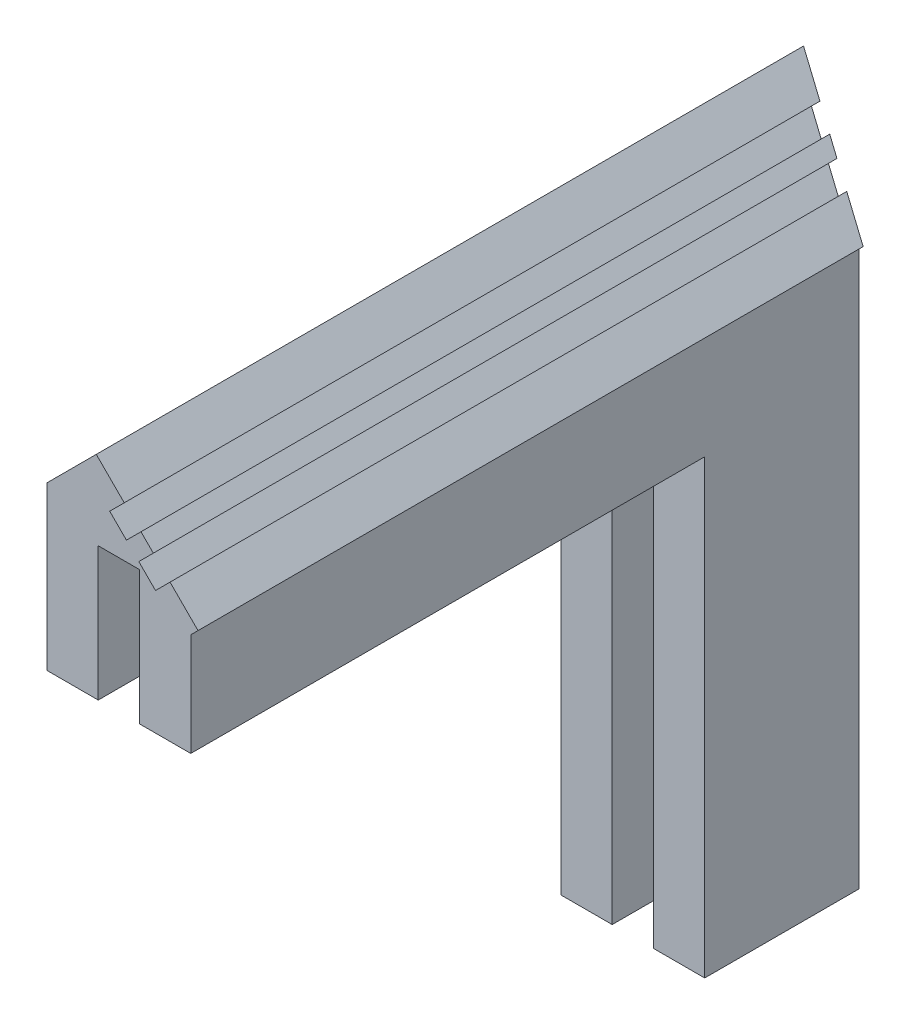
ISO-10303-21;
HEADER;
FILE_DESCRIPTION(('STEP AP214'),'2;1');
FILE_NAME('part.step','',(''),(''),'','','');
FILE_SCHEMA(('AUTOMOTIVE_DESIGN { 1 0 10303 214 1 1 1 1 }'));
ENDSEC;
DATA;
#1=APPLICATION_CONTEXT('core data for automotive mechanical design processes');
#2=APPLICATION_PROTOCOL_DEFINITION('international standard','automotive_design',2000,#1);
#3=PRODUCT_CONTEXT('',#1,'mechanical');
#4=PRODUCT('Part','Part','',(#3));
#5=PRODUCT_RELATED_PRODUCT_CATEGORY('part','',(#4));
#6=PRODUCT_DEFINITION_FORMATION('','',#4);
#7=PRODUCT_DEFINITION_CONTEXT('part definition',#1,'design');
#8=PRODUCT_DEFINITION('design','',#6,#7);
#9=PRODUCT_DEFINITION_SHAPE('','',#8);
#10=(LENGTH_UNIT() NAMED_UNIT(*) SI_UNIT(.MILLI.,.METRE.));
#11=(NAMED_UNIT(*) PLANE_ANGLE_UNIT() SI_UNIT($,.RADIAN.));
#12=(NAMED_UNIT(*) SI_UNIT($,.STERADIAN.) SOLID_ANGLE_UNIT());
#13=UNCERTAINTY_MEASURE_WITH_UNIT(LENGTH_MEASURE(1.E-05),#10,'distance_accuracy_value','');
#14=(GEOMETRIC_REPRESENTATION_CONTEXT(3) GLOBAL_UNCERTAINTY_ASSIGNED_CONTEXT((#13)) GLOBAL_UNIT_ASSIGNED_CONTEXT((#10,
#11,#12)) REPRESENTATION_CONTEXT('',''));
#15=CARTESIAN_POINT('',(0.,0.,0.));
#16=DIRECTION('',(0.,0.,1.));
#17=DIRECTION('',(1.,0.,0.));
#18=AXIS2_PLACEMENT_3D('',#15,#16,#17);
#19=CARTESIAN_POINT('',(0.707106781186546,0.707106781186549,-17.5217474244804));
#20=DIRECTION('',(0.707106781186544,0.707106781186551,0.));
#21=DIRECTION('',(-0.707106781186551,0.707106781186544,0.));
#22=AXIS2_PLACEMENT_3D('',#19,#20,#21);
#23=PLANE('',#22);
#24=DIRECTION('',(-0.678598344545851,0.678598344545844,-0.281084637714817));
#25=VECTOR('',#24,1.);
#26=CARTESIAN_POINT('',(-2.69092137036364,4.1051349327367,-1.1146161268842));
#27=LINE('',#26,#25);
#28=CARTESIAN_POINT('',(-3.64159992311075,5.05581348548379,-1.50840007688926));
#29=VERTEX_POINT('',#28);
#30=CARTESIAN_POINT('',(-4.84368145112788,6.25789501350092,-2.00631854887213));
#31=VERTEX_POINT('',#30);
#32=EDGE_CURVE('E230',#29,#31,#27,.T.);
#33=ORIENTED_EDGE('',*,*,#32,.T.);
#34=DIRECTION('',(0.,0.,1.));
#35=VECTOR('',#34,1.);
#36=CARTESIAN_POINT('',(-4.84368145112788,6.25789501350092,-7.11318219994969));
#37=LINE('',#36,#35);
#38=CARTESIAN_POINT('',(-4.84368145112789,6.25789501350092,65.));
#39=VERTEX_POINT('',#38);
#40=EDGE_CURVE('E214',#31,#39,#37,.T.);
#41=ORIENTED_EDGE('',*,*,#40,.T.);
#42=DIRECTION('',(-0.707106781186551,0.707106781186544,0.));
#43=VECTOR('',#42,1.);
#44=CARTESIAN_POINT('',(0.707106781186546,0.707106781186549,65.));
#45=LINE('',#44,#43);
#46=CARTESIAN_POINT('',(-3.64159992311074,5.05581348548379,65.));
#47=VERTEX_POINT('',#46);
#48=EDGE_CURVE('E472',#47,#39,#45,.T.);
#49=ORIENTED_EDGE('',*,*,#48,.F.);
#50=DIRECTION('',(0.,0.,1.));
#51=VECTOR('',#50,1.);
#52=CARTESIAN_POINT('',(-3.64159992311074,5.05581348548379,-7.11318219994969));
#53=LINE('',#52,#51);
#54=EDGE_CURVE('E237',#29,#47,#53,.T.);
#55=ORIENTED_EDGE('',*,*,#54,.F.);
#56=EDGE_LOOP('',(#33,#41,#49,#55));
#57=FACE_BOUND('',#56,.T.);
#58=ADVANCED_FACE('F65',(#57),#23,.T.);
#59=CARTESIAN_POINT('',(0.707106781186546,0.707106781186548,0.292893218813449));
#60=VERTEX_POINT('',#59);
#61=CARTESIAN_POINT('',(-2.01525432638168,3.42946788875474,-0.83474567361833));
#62=VERTEX_POINT('',#61);
#63=EDGE_CURVE('E239',#60,#62,#27,.T.);
#64=ORIENTED_EDGE('',*,*,#63,.T.);
#65=DIRECTION('',(0.,0.,1.));
#66=VECTOR('',#65,1.);
#67=CARTESIAN_POINT('',(-2.01525432638168,3.42946788875474,-7.11318219994969));
#68=LINE('',#67,#66);
#69=CARTESIAN_POINT('',(-2.01525432638168,3.42946788875474,65.));
#70=VERTEX_POINT('',#69);
#71=EDGE_CURVE('E444',#62,#70,#68,.T.);
#72=ORIENTED_EDGE('',*,*,#71,.T.);
#73=CARTESIAN_POINT('',(0.707106781186546,0.707106781186549,65.));
#74=VERTEX_POINT('',#73);
#75=EDGE_CURVE('E469',#74,#70,#45,.T.);
#76=ORIENTED_EDGE('',*,*,#75,.F.);
#77=DIRECTION('',(0.,0.,1.));
#78=VECTOR('',#77,1.);
#79=CARTESIAN_POINT('',(0.707106781186546,0.707106781186549,-17.5217474244804));
#80=LINE('',#79,#78);
#81=EDGE_CURVE('E246',#60,#74,#80,.T.);
#82=ORIENTED_EDGE('',*,*,#81,.F.);
#83=EDGE_LOOP('',(#64,#72,#76,#82));
#84=FACE_BOUND('',#83,.T.);
#85=ADVANCED_FACE('F489',(#84),#23,.T.);
#86=CARTESIAN_POINT('',(0.,-53.9167663003001,15.));
#87=DIRECTION('',(0.,0.,1.));
#88=DIRECTION('',(1.,0.,0.));
#89=AXIS2_PLACEMENT_3D('',#86,#87,#88);
#90=PLANE('',#89);
#91=DIRECTION('',(0.,1.,0.));
#92=VECTOR('',#91,1.);
#93=CARTESIAN_POINT('',(0.,-53.9167663003001,15.));
#94=LINE('',#93,#92);
#95=CARTESIAN_POINT('',(0.,-53.9167663003001,15.));
#96=VERTEX_POINT('',#95);
#97=CARTESIAN_POINT('',(0.,-10.,15.));
#98=VERTEX_POINT('',#97);
#99=EDGE_CURVE('E75',#96,#98,#94,.T.);
#100=ORIENTED_EDGE('',*,*,#99,.T.);
#101=DIRECTION('',(-1.,0.,0.));
#102=VECTOR('',#101,1.);
#103=CARTESIAN_POINT('',(0.,-10.,15.));
#104=LINE('',#103,#102);
#105=CARTESIAN_POINT('',(-5.,-10.,15.));
#106=VERTEX_POINT('',#105);
#107=EDGE_CURVE('E266',#98,#106,#104,.T.);
#108=ORIENTED_EDGE('',*,*,#107,.T.);
#109=DIRECTION('',(0.,1.,0.));
#110=VECTOR('',#109,1.);
#111=CARTESIAN_POINT('',(-5.,-53.9167663003001,15.));
#112=LINE('',#111,#110);
#113=CARTESIAN_POINT('',(-5.,-53.9167663003001,15.));
#114=VERTEX_POINT('',#113);
#115=EDGE_CURVE('E362',#114,#106,#112,.T.);
#116=ORIENTED_EDGE('',*,*,#115,.F.);
#117=DIRECTION('',(1.,0.,0.));
#118=VECTOR('',#117,1.);
#119=CARTESIAN_POINT('',(0.,-53.9167663003001,15.));
#120=LINE('',#119,#118);
#121=EDGE_CURVE('E348',#114,#96,#120,.T.);
#122=ORIENTED_EDGE('',*,*,#121,.T.);
#123=EDGE_LOOP('',(#100,#108,#116,#122));
#124=FACE_BOUND('',#123,.T.);
#125=ADVANCED_FACE('F507',(#124),#90,.T.);
#126=DIRECTION('',(0.,1.,0.));
#127=VECTOR('',#126,1.);
#128=CARTESIAN_POINT('',(-9.,-53.9167663003001,15.));
#129=LINE('',#128,#127);
#130=CARTESIAN_POINT('',(-9.,-53.9167663003001,15.));
#131=VERTEX_POINT('',#130);
#132=CARTESIAN_POINT('',(-9.,-10.,15.));
#133=VERTEX_POINT('',#132);
#134=EDGE_CURVE('E374',#131,#133,#129,.T.);
#135=ORIENTED_EDGE('',*,*,#134,.T.);
#136=DIRECTION('',(-1.,0.,0.));
#137=VECTOR('',#136,1.);
#138=CARTESIAN_POINT('',(0.,-10.,15.));
#139=LINE('',#138,#137);
#140=CARTESIAN_POINT('',(-14.,-10.,15.));
#141=VERTEX_POINT('',#140);
#142=EDGE_CURVE('E272',#133,#141,#139,.T.);
#143=ORIENTED_EDGE('',*,*,#142,.T.);
#144=DIRECTION('',(0.,1.,0.));
#145=VECTOR('',#144,1.);
#146=CARTESIAN_POINT('',(-14.,-53.9167663003001,15.));
#147=LINE('',#146,#145);
#148=CARTESIAN_POINT('',(-14.,-53.9167663003001,15.));
#149=VERTEX_POINT('',#148);
#150=EDGE_CURVE('E377',#149,#141,#147,.T.);
#151=ORIENTED_EDGE('',*,*,#150,.F.);
#152=DIRECTION('',(1.,0.,0.));
#153=VECTOR('',#152,1.);
#154=CARTESIAN_POINT('',(-9.,-53.9167663003001,15.));
#155=LINE('',#154,#153);
#156=EDGE_CURVE('E332',#149,#131,#155,.T.);
#157=ORIENTED_EDGE('',*,*,#156,.T.);
#158=EDGE_LOOP('',(#135,#143,#151,#157));
#159=FACE_BOUND('',#158,.T.);
#160=ADVANCED_FACE('F399',(#159),#90,.T.);
#161=CARTESIAN_POINT('',(-5.,-53.9167663003001,15.));
#162=DIRECTION('',(-1.,0.,0.));
#163=DIRECTION('',(0.,0.,1.));
#164=AXIS2_PLACEMENT_3D('',#161,#162,#163);
#165=PLANE('',#164);
#166=ORIENTED_EDGE('',*,*,#115,.T.);
#167=DIRECTION('',(0.,0.,-1.));
#168=VECTOR('',#167,1.);
#169=CARTESIAN_POINT('',(-5.,-10.,65.));
#170=LINE('',#169,#168);
#171=CARTESIAN_POINT('',(-5.,-10.,65.));
#172=VERTEX_POINT('',#171);
#173=EDGE_CURVE('E294',#172,#106,#170,.T.);
#174=ORIENTED_EDGE('',*,*,#173,.F.);
#175=DIRECTION('',(0.,-1.,0.));
#176=VECTOR('',#175,1.);
#177=CARTESIAN_POINT('',(-5.,0.,65.));
#178=LINE('',#177,#176);
#179=CARTESIAN_POINT('',(-5.,2.99999999999999,65.));
#180=VERTEX_POINT('',#179);
#181=EDGE_CURVE('E291',#180,#172,#178,.T.);
#182=ORIENTED_EDGE('',*,*,#181,.F.);
#183=DIRECTION('',(0.,0.,-1.));
#184=VECTOR('',#183,1.);
#185=CARTESIAN_POINT('',(-5.00000000000004,2.99999999999999,15.));
#186=LINE('',#185,#184);
#187=CARTESIAN_POINT('',(-5.00000000000004,2.99999999999999,1.99999999999999));
#188=VERTEX_POINT('',#187);
#189=EDGE_CURVE('E316',#180,#188,#186,.T.);
#190=ORIENTED_EDGE('',*,*,#189,.T.);
#191=DIRECTION('',(0.,1.,0.));
#192=VECTOR('',#191,1.);
#193=CARTESIAN_POINT('',(-5.00000000000004,-53.9167663003001,1.99999999999999));
#194=LINE('',#193,#192);
#195=CARTESIAN_POINT('',(-5.00000000000004,-53.9167663003001,1.99999999999999));
#196=VERTEX_POINT('',#195);
#197=EDGE_CURVE('E366',#196,#188,#194,.T.);
#198=ORIENTED_EDGE('',*,*,#197,.F.);
#199=DIRECTION('',(0.,0.,1.));
#200=VECTOR('',#199,1.);
#201=CARTESIAN_POINT('',(-5.,-53.9167663003001,15.));
#202=LINE('',#201,#200);
#203=EDGE_CURVE('E344',#196,#114,#202,.T.);
#204=ORIENTED_EDGE('',*,*,#203,.T.);
#205=EDGE_LOOP('',(#166,#174,#182,#190,#198,#204));
#206=FACE_BOUND('',#205,.T.);
#207=ADVANCED_FACE('F510',(#206),#165,.T.);
#208=CARTESIAN_POINT('',(-5.00000000000004,-53.9167663003001,1.99999999999999));
#209=DIRECTION('',(0.,0.,1.));
#210=DIRECTION('',(1.,0.,0.));
#211=AXIS2_PLACEMENT_3D('',#208,#209,#210);
#212=PLANE('',#211);
#213=ORIENTED_EDGE('',*,*,#197,.T.);
#214=DIRECTION('',(1.,0.,0.));
#215=VECTOR('',#214,1.);
#216=CARTESIAN_POINT('',(-5.00000000000004,2.99999999999999,1.99999999999999));
#217=LINE('',#216,#215);
#218=CARTESIAN_POINT('',(-9.00000000000004,2.99999999999999,1.99999999999999));
#219=VERTEX_POINT('',#218);
#220=EDGE_CURVE('E312',#219,#188,#217,.T.);
#221=ORIENTED_EDGE('',*,*,#220,.F.);
#222=DIRECTION('',(0.,1.,0.));
#223=VECTOR('',#222,1.);
#224=CARTESIAN_POINT('',(-9.00000000000004,-53.9167663003001,1.99999999999999));
#225=LINE('',#224,#223);
#226=CARTESIAN_POINT('',(-9.00000000000004,-53.9167663003001,1.99999999999999));
#227=VERTEX_POINT('',#226);
#228=EDGE_CURVE('E370',#227,#219,#225,.T.);
#229=ORIENTED_EDGE('',*,*,#228,.F.);
#230=DIRECTION('',(1.,0.,0.));
#231=VECTOR('',#230,1.);
#232=CARTESIAN_POINT('',(-5.00000000000004,-53.9167663003001,1.99999999999999));
#233=LINE('',#232,#231);
#234=EDGE_CURVE('E340',#227,#196,#233,.T.);
#235=ORIENTED_EDGE('',*,*,#234,.T.);
#236=EDGE_LOOP('',(#213,#221,#229,#235));
#237=FACE_BOUND('',#236,.T.);
#238=ADVANCED_FACE('F512',(#237),#212,.T.);
#239=CARTESIAN_POINT('',(-9.00000000000004,-53.9167663003001,1.99999999999999));
#240=DIRECTION('',(1.,0.,0.));
#241=DIRECTION('',(0.,0.,-1.));
#242=AXIS2_PLACEMENT_3D('',#239,#240,#241);
#243=PLANE('',#242);
#244=ORIENTED_EDGE('',*,*,#228,.T.);
#245=DIRECTION('',(0.,0.,-1.));
#246=VECTOR('',#245,1.);
#247=CARTESIAN_POINT('',(-9.00000000000004,2.99999999999999,15.));
#248=LINE('',#247,#246);
#249=CARTESIAN_POINT('',(-9.,2.99999999999999,65.));
#250=VERTEX_POINT('',#249);
#251=EDGE_CURVE('E319',#250,#219,#248,.T.);
#252=ORIENTED_EDGE('',*,*,#251,.F.);
#253=DIRECTION('',(0.,1.,0.));
#254=VECTOR('',#253,1.);
#255=CARTESIAN_POINT('',(-9.,0.,65.));
#256=LINE('',#255,#254);
#257=CARTESIAN_POINT('',(-9.,-10.,65.));
#258=VERTEX_POINT('',#257);
#259=EDGE_CURVE('E283',#258,#250,#256,.T.);
#260=ORIENTED_EDGE('',*,*,#259,.F.);
#261=DIRECTION('',(0.,0.,-1.));
#262=VECTOR('',#261,1.);
#263=CARTESIAN_POINT('',(-9.,-10.,65.));
#264=LINE('',#263,#262);
#265=EDGE_CURVE('E303',#258,#133,#264,.T.);
#266=ORIENTED_EDGE('',*,*,#265,.T.);
#267=ORIENTED_EDGE('',*,*,#134,.F.);
#268=DIRECTION('',(0.,0.,-1.));
#269=VECTOR('',#268,1.);
#270=CARTESIAN_POINT('',(-9.00000000000004,-53.9167663003001,1.99999999999999));
#271=LINE('',#270,#269);
#272=EDGE_CURVE('E336',#131,#227,#271,.T.);
#273=ORIENTED_EDGE('',*,*,#272,.T.);
#274=EDGE_LOOP('',(#244,#252,#260,#266,#267,#273));
#275=FACE_BOUND('',#274,.T.);
#276=ADVANCED_FACE('F517',(#275),#243,.T.);
#277=CARTESIAN_POINT('',(0.,-53.9167663003001,0.));
#278=DIRECTION('',(0.382683432365084,0.,-0.923879532511289));
#279=DIRECTION('',(-0.923879532511289,0.,-0.382683432365084));
#280=AXIS2_PLACEMENT_3D('',#277,#278,#279);
#281=PLANE('',#280);
#282=DIRECTION('',(-0.678598344545847,-0.678598344545849,-0.281084637714815));
#283=VECTOR('',#282,1.);
#284=CARTESIAN_POINT('',(-7.96687248864025,6.38739516944667,-3.29998663449183));
#285=LINE('',#284,#283);
#286=CARTESIAN_POINT('',(-6.47002704785695,7.88424061022997,-2.67997295214306));
#287=VERTEX_POINT('',#286);
#288=CARTESIAN_POINT('',(-7.88424061023004,6.47002704785687,-3.26575938976995));
#289=VERTEX_POINT('',#288);
#290=EDGE_CURVE('E416',#287,#289,#285,.T.);
#291=ORIENTED_EDGE('',*,*,#290,.T.);
#292=DIRECTION('',(-0.678598344545852,0.678598344545844,-0.281084637714817));
#293=VECTOR('',#292,1.);
#294=CARTESIAN_POINT('',(-2.0080330487244,0.593819486351297,-0.831754522475026));
#295=LINE('',#294,#293);
#296=CARTESIAN_POINT('',(-6.25789501350097,4.84368145112782,-2.59210498649902));
#297=VERTEX_POINT('',#296);
#298=EDGE_CURVE('E232',#297,#289,#295,.T.);
#299=ORIENTED_EDGE('',*,*,#298,.F.);
#300=DIRECTION('',(-0.678598344545847,-0.678598344545849,-0.281084637714815));
#301=VECTOR('',#300,1.);
#302=CARTESIAN_POINT('',(-6.46902213762315,4.63255432700565,-2.67955670469525));
#303=LINE('',#302,#301);
#304=EDGE_CURVE('E217',#31,#297,#303,.T.);
#305=ORIENTED_EDGE('',*,*,#304,.F.);
#306=ORIENTED_EDGE('',*,*,#32,.F.);
#307=DIRECTION('',(-0.678598344545848,-0.678598344545848,-0.281084637714816));
#308=VECTOR('',#307,1.);
#309=CARTESIAN_POINT('',(-5.36191535643659,3.33549805215795,-2.22097806093257));
#310=LINE('',#309,#308);
#311=CARTESIAN_POINT('',(-5.05581348548379,3.64159992311075,-2.09418651451614));
#312=VERTEX_POINT('',#311);
#313=EDGE_CURVE('E449',#29,#312,#310,.T.);
#314=ORIENTED_EDGE('',*,*,#313,.T.);
#315=DIRECTION('',(-0.678598344545833,0.678598344545865,-0.28108463771481));
#316=VECTOR('',#315,1.);
#317=CARTESIAN_POINT('',(-2.00803304872443,0.593819486351235,-0.831754522475037));
#318=LINE('',#317,#316);
#319=CARTESIAN_POINT('',(-3.42946788875477,2.01525432638164,-1.42053211124522));
#320=VERTEX_POINT('',#319);
#321=EDGE_CURVE('E453',#320,#312,#318,.T.);
#322=ORIENTED_EDGE('',*,*,#321,.F.);
#323=DIRECTION('',(-0.678598344545847,-0.678598344545849,-0.281084637714815));
#324=VECTOR('',#323,1.);
#325=CARTESIAN_POINT('',(-3.8640650054195,1.58065720971692,-1.60054813113599));
#326=LINE('',#325,#324);
#327=EDGE_CURVE('E441',#62,#320,#326,.T.);
#328=ORIENTED_EDGE('',*,*,#327,.F.);
#329=ORIENTED_EDGE('',*,*,#63,.F.);
#330=DIRECTION('',(0.678598344545847,0.678598344545849,0.281084637714815));
#331=VECTOR('',#330,1.);
#332=CARTESIAN_POINT('',(-3.34216065341451,-3.34216065341452,-1.38436827027399));
#333=LINE('',#332,#331);
#334=CARTESIAN_POINT('',(0.,0.,0.));
#335=VERTEX_POINT('',#334);
#336=EDGE_CURVE('E249',#335,#60,#333,.T.);
#337=ORIENTED_EDGE('',*,*,#336,.F.);
#338=DIRECTION('',(0.,1.,0.));
#339=VECTOR('',#338,1.);
#340=CARTESIAN_POINT('',(0.,-53.9167663003001,0.));
#341=LINE('',#340,#339);
#342=CARTESIAN_POINT('',(0.,-53.9167663003001,0.));
#343=VERTEX_POINT('',#342);
#344=EDGE_CURVE('E12',#343,#335,#341,.T.);
#345=ORIENTED_EDGE('',*,*,#344,.F.);
#346=DIRECTION('',(-0.923879532511289,0.,-0.382683432365084));
#347=VECTOR('',#346,1.);
#348=CARTESIAN_POINT('',(0.,-53.9167663003001,0.));
#349=LINE('',#348,#347);
#350=CARTESIAN_POINT('',(-14.,-53.9167663003001,-5.79898987322323));
#351=VERTEX_POINT('',#350);
#352=EDGE_CURVE('E324',#343,#351,#349,.T.);
#353=ORIENTED_EDGE('',*,*,#352,.T.);
#354=DIRECTION('',(0.,1.,0.));
#355=VECTOR('',#354,1.);
#356=CARTESIAN_POINT('',(-14.,-53.9167663003001,-5.79898987322323));
#357=LINE('',#356,#355);
#358=CARTESIAN_POINT('',(-14.,5.79898987322329,-5.79898987322323));
#359=VERTEX_POINT('',#358);
#360=EDGE_CURVE('E69',#351,#359,#357,.T.);
#361=ORIENTED_EDGE('',*,*,#360,.T.);
#362=DIRECTION('',(-0.678598344545844,-0.678598344545852,-0.281084637714814));
#363=VECTOR('',#362,1.);
#364=CARTESIAN_POINT('',(-33.9457897147053,-14.1467998414823,-14.0608064852958));
#365=LINE('',#364,#363);
#366=CARTESIAN_POINT('',(-9.19238815542517,10.6066017177982,-3.80761184457484));
#367=VERTEX_POINT('',#366);
#368=EDGE_CURVE('E263',#367,#359,#365,.T.);
#369=ORIENTED_EDGE('',*,*,#368,.F.);
#370=EDGE_CURVE('E240',#287,#367,#27,.T.);
#371=ORIENTED_EDGE('',*,*,#370,.F.);
#372=EDGE_LOOP('',(#291,#299,#305,#306,#314,#322,#328,#329,#337,#345,#353,#361,#369,#371));
#373=FACE_BOUND('',#372,.T.);
#374=ADVANCED_FACE('F67',(#373),#281,.T.);
#375=CARTESIAN_POINT('',(0.,-53.9167663003001,0.));
#376=DIRECTION('',(1.,0.,0.));
#377=DIRECTION('',(0.,0.,-1.));
#378=AXIS2_PLACEMENT_3D('',#375,#376,#377);
#379=PLANE('',#378);
#380=DIRECTION('',(0.,0.,-1.));
#381=VECTOR('',#380,1.);
#382=CARTESIAN_POINT('',(0.,0.,0.));
#383=LINE('',#382,#381);
#384=CARTESIAN_POINT('',(0.,0.,65.));
#385=VERTEX_POINT('',#384);
#386=EDGE_CURVE('E323',#385,#335,#383,.T.);
#387=ORIENTED_EDGE('',*,*,#386,.F.);
#388=DIRECTION('',(0.,1.,0.));
#389=VECTOR('',#388,1.);
#390=CARTESIAN_POINT('',(0.,0.,65.));
#391=LINE('',#390,#389);
#392=CARTESIAN_POINT('',(0.,-10.,65.));
#393=VERTEX_POINT('',#392);
#394=EDGE_CURVE('E271',#393,#385,#391,.T.);
#395=ORIENTED_EDGE('',*,*,#394,.F.);
#396=DIRECTION('',(0.,0.,-1.));
#397=VECTOR('',#396,1.);
#398=CARTESIAN_POINT('',(0.,-10.,65.));
#399=LINE('',#398,#397);
#400=EDGE_CURVE('E309',#393,#98,#399,.T.);
#401=ORIENTED_EDGE('',*,*,#400,.T.);
#402=ORIENTED_EDGE('',*,*,#99,.F.);
#403=DIRECTION('',(0.,0.,-1.));
#404=VECTOR('',#403,1.);
#405=CARTESIAN_POINT('',(0.,-53.9167663003001,0.));
#406=LINE('',#405,#404);
#407=EDGE_CURVE('E352',#96,#343,#406,.T.);
#408=ORIENTED_EDGE('',*,*,#407,.T.);
#409=ORIENTED_EDGE('',*,*,#344,.T.);
#410=EDGE_LOOP('',(#387,#395,#401,#402,#408,#409));
#411=FACE_BOUND('',#410,.T.);
#412=ADVANCED_FACE('F498',(#411),#379,.T.);
#413=CARTESIAN_POINT('',(-14.,-53.9167663003001,15.));
#414=DIRECTION('',(-1.,0.,0.));
#415=DIRECTION('',(0.,0.,1.));
#416=AXIS2_PLACEMENT_3D('',#413,#414,#415);
#417=PLANE('',#416);
#418=DIRECTION('',(0.,0.,1.));
#419=VECTOR('',#418,1.);
#420=CARTESIAN_POINT('',(-14.,5.79898987322329,-5.79898987322323));
#421=LINE('',#420,#419);
#422=CARTESIAN_POINT('',(-14.,5.79898987322329,65.));
#423=VERTEX_POINT('',#422);
#424=EDGE_CURVE('E260',#359,#423,#421,.T.);
#425=ORIENTED_EDGE('',*,*,#424,.F.);
#426=ORIENTED_EDGE('',*,*,#360,.F.);
#427=DIRECTION('',(0.,0.,1.));
#428=VECTOR('',#427,1.);
#429=CARTESIAN_POINT('',(-14.,-53.9167663003001,15.));
#430=LINE('',#429,#428);
#431=EDGE_CURVE('E328',#351,#149,#430,.T.);
#432=ORIENTED_EDGE('',*,*,#431,.T.);
#433=ORIENTED_EDGE('',*,*,#150,.T.);
#434=DIRECTION('',(0.,0.,-1.));
#435=VECTOR('',#434,1.);
#436=CARTESIAN_POINT('',(-14.,-10.,65.));
#437=LINE('',#436,#435);
#438=CARTESIAN_POINT('',(-14.,-10.,65.));
#439=VERTEX_POINT('',#438);
#440=EDGE_CURVE('E306',#439,#141,#437,.T.);
#441=ORIENTED_EDGE('',*,*,#440,.F.);
#442=DIRECTION('',(0.,-1.,0.));
#443=VECTOR('',#442,1.);
#444=CARTESIAN_POINT('',(-14.,0.,65.));
#445=LINE('',#444,#443);
#446=EDGE_CURVE('E276',#423,#439,#445,.T.);
#447=ORIENTED_EDGE('',*,*,#446,.F.);
#448=EDGE_LOOP('',(#425,#426,#432,#433,#441,#447));
#449=FACE_BOUND('',#448,.T.);
#450=ADVANCED_FACE('F390',(#449),#417,.T.);
#451=CARTESIAN_POINT('',(0.,-53.9167663003001,0.));
#452=DIRECTION('',(0.,-1.,0.));
#453=DIRECTION('',(0.,0.,-1.));
#454=AXIS2_PLACEMENT_3D('',#451,#452,#453);
#455=PLANE('',#454);
#456=ORIENTED_EDGE('',*,*,#352,.F.);
#457=ORIENTED_EDGE('',*,*,#407,.F.);
#458=ORIENTED_EDGE('',*,*,#121,.F.);
#459=ORIENTED_EDGE('',*,*,#203,.F.);
#460=ORIENTED_EDGE('',*,*,#234,.F.);
#461=ORIENTED_EDGE('',*,*,#272,.F.);
#462=ORIENTED_EDGE('',*,*,#156,.F.);
#463=ORIENTED_EDGE('',*,*,#431,.F.);
#464=EDGE_LOOP('',(#456,#457,#458,#459,#460,#461,#462,#463));
#465=FACE_BOUND('',#464,.T.);
#466=ADVANCED_FACE('F394',(#465),#455,.T.);
#467=CARTESIAN_POINT('',(-5.00000000000004,2.99999999999999,15.));
#468=DIRECTION('',(0.,1.,0.));
#469=DIRECTION('',(-1.,0.,0.));
#470=AXIS2_PLACEMENT_3D('',#467,#468,#469);
#471=PLANE('',#470);
#472=ORIENTED_EDGE('',*,*,#220,.T.);
#473=ORIENTED_EDGE('',*,*,#189,.F.);
#474=DIRECTION('',(1.,0.,0.));
#475=VECTOR('',#474,1.);
#476=CARTESIAN_POINT('',(0.,2.99999999999998,65.));
#477=LINE('',#476,#475);
#478=EDGE_CURVE('E287',#250,#180,#477,.T.);
#479=ORIENTED_EDGE('',*,*,#478,.F.);
#480=ORIENTED_EDGE('',*,*,#251,.T.);
#481=EDGE_LOOP('',(#472,#473,#479,#480));
#482=FACE_BOUND('',#481,.T.);
#483=ADVANCED_FACE('F514',(#482),#471,.F.);
#484=CARTESIAN_POINT('',(0.,-10.,65.));
#485=DIRECTION('',(0.,-1.,0.));
#486=DIRECTION('',(0.,0.,-1.));
#487=AXIS2_PLACEMENT_3D('',#484,#485,#486);
#488=PLANE('',#487);
#489=ORIENTED_EDGE('',*,*,#107,.F.);
#490=ORIENTED_EDGE('',*,*,#400,.F.);
#491=DIRECTION('',(-1.,0.,0.));
#492=VECTOR('',#491,1.);
#493=CARTESIAN_POINT('',(0.,-10.,65.));
#494=LINE('',#493,#492);
#495=EDGE_CURVE('E267',#393,#172,#494,.T.);
#496=ORIENTED_EDGE('',*,*,#495,.T.);
#497=ORIENTED_EDGE('',*,*,#173,.T.);
#498=EDGE_LOOP('',(#489,#490,#496,#497));
#499=FACE_BOUND('',#498,.T.);
#500=ADVANCED_FACE('F504',(#499),#488,.T.);
#501=CARTESIAN_POINT('',(0.,-10.,65.));
#502=DIRECTION('',(0.,-1.,0.));
#503=DIRECTION('',(1.,0.,0.));
#504=AXIS2_PLACEMENT_3D('',#501,#502,#503);
#505=PLANE('',#504);
#506=ORIENTED_EDGE('',*,*,#142,.F.);
#507=ORIENTED_EDGE('',*,*,#265,.F.);
#508=DIRECTION('',(-1.,0.,0.));
#509=VECTOR('',#508,1.);
#510=CARTESIAN_POINT('',(0.,-10.,65.));
#511=LINE('',#510,#509);
#512=EDGE_CURVE('E279',#258,#439,#511,.T.);
#513=ORIENTED_EDGE('',*,*,#512,.T.);
#514=ORIENTED_EDGE('',*,*,#440,.T.);
#515=EDGE_LOOP('',(#506,#507,#513,#514));
#516=FACE_BOUND('',#515,.T.);
#517=ADVANCED_FACE('F402',(#516),#505,.T.);
#518=CARTESIAN_POINT('',(0.,0.,65.));
#519=DIRECTION('',(0.,0.,1.));
#520=DIRECTION('',(1.,0.,0.));
#521=AXIS2_PLACEMENT_3D('',#518,#519,#520);
#522=PLANE('',#521);
#523=DIRECTION('',(-0.707106781186546,-0.707106781186549,0.));
#524=VECTOR('',#523,1.);
#525=CARTESIAN_POINT('',(-7.17713382904347,7.17713382904345,65.));
#526=LINE('',#525,#524);
#527=CARTESIAN_POINT('',(-6.47002704785695,7.88424061022997,65.));
#528=VERTEX_POINT('',#527);
#529=CARTESIAN_POINT('',(-7.88424061023004,6.47002704785687,65.));
#530=VERTEX_POINT('',#529);
#531=EDGE_CURVE('E234',#528,#530,#526,.T.);
#532=ORIENTED_EDGE('',*,*,#531,.F.);
#533=CARTESIAN_POINT('',(-9.19238815542517,10.6066017177982,65.));
#534=VERTEX_POINT('',#533);
#535=EDGE_CURVE('E410',#528,#534,#45,.T.);
#536=ORIENTED_EDGE('',*,*,#535,.T.);
#537=DIRECTION('',(0.707106781186544,0.707106781186552,0.));
#538=VECTOR('',#537,1.);
#539=CARTESIAN_POINT('',(-9.89949493661172,9.89949493661161,65.));
#540=LINE('',#539,#538);
#541=EDGE_CURVE('E254',#423,#534,#540,.T.);
#542=ORIENTED_EDGE('',*,*,#541,.F.);
#543=ORIENTED_EDGE('',*,*,#446,.T.);
#544=ORIENTED_EDGE('',*,*,#512,.F.);
#545=ORIENTED_EDGE('',*,*,#259,.T.);
#546=ORIENTED_EDGE('',*,*,#478,.T.);
#547=ORIENTED_EDGE('',*,*,#181,.T.);
#548=ORIENTED_EDGE('',*,*,#495,.F.);
#549=ORIENTED_EDGE('',*,*,#394,.T.);
#550=DIRECTION('',(0.707106781186546,0.707106781186549,0.));
#551=VECTOR('',#550,1.);
#552=CARTESIAN_POINT('',(0.,0.,65.));
#553=LINE('',#552,#551);
#554=EDGE_CURVE('E457',#385,#74,#553,.T.);
#555=ORIENTED_EDGE('',*,*,#554,.T.);
#556=ORIENTED_EDGE('',*,*,#75,.T.);
#557=DIRECTION('',(-0.707106781186546,-0.707106781186549,0.));
#558=VECTOR('',#557,1.);
#559=CARTESIAN_POINT('',(-2.72236110756821,2.7223611075682,65.));
#560=LINE('',#559,#558);
#561=CARTESIAN_POINT('',(-3.42946788875477,2.01525432638164,65.));
#562=VERTEX_POINT('',#561);
#563=EDGE_CURVE('E91',#70,#562,#560,.T.);
#564=ORIENTED_EDGE('',*,*,#563,.T.);
#565=DIRECTION('',(-0.707106781186531,0.707106781186564,0.));
#566=VECTOR('',#565,1.);
#567=CARTESIAN_POINT('',(-0.707106781186643,-0.70710678118661,65.));
#568=LINE('',#567,#566);
#569=CARTESIAN_POINT('',(-5.05581348548379,3.64159992311075,65.));
#570=VERTEX_POINT('',#569);
#571=EDGE_CURVE('E445',#562,#570,#568,.T.);
#572=ORIENTED_EDGE('',*,*,#571,.T.);
#573=DIRECTION('',(-0.707106781186548,-0.707106781186547,0.));
#574=VECTOR('',#573,1.);
#575=CARTESIAN_POINT('',(-4.34870670429727,4.34870670429727,65.));
#576=LINE('',#575,#574);
#577=EDGE_CURVE('E437',#47,#570,#576,.T.);
#578=ORIENTED_EDGE('',*,*,#577,.F.);
#579=ORIENTED_EDGE('',*,*,#48,.T.);
#580=DIRECTION('',(-0.707106781186546,-0.707106781186549,0.));
#581=VECTOR('',#580,1.);
#582=CARTESIAN_POINT('',(-5.55078823231441,5.55078823231439,65.));
#583=LINE('',#582,#581);
#584=CARTESIAN_POINT('',(-6.25789501350097,4.84368145112782,65.));
#585=VERTEX_POINT('',#584);
#586=EDGE_CURVE('E83',#39,#585,#583,.T.);
#587=ORIENTED_EDGE('',*,*,#586,.T.);
#588=DIRECTION('',(-0.707106781186552,0.707106781186544,0.));
#589=VECTOR('',#588,1.);
#590=CARTESIAN_POINT('',(-0.707106781186542,-0.70710678118655,65.));
#591=LINE('',#590,#589);
#592=EDGE_CURVE('E420',#585,#530,#591,.T.);
#593=ORIENTED_EDGE('',*,*,#592,.T.);
#594=EDGE_LOOP('',(#532,#536,#542,#543,#544,#545,#546,#547,#548,#549,#555,#556,#564,#572,#578,
#579,#587,#593));
#595=FACE_BOUND('',#594,.T.);
#596=ADVANCED_FACE('F408',(#595),#522,.T.);
#597=CARTESIAN_POINT('',(-9.89949493661172,9.89949493661161,-5.79898987322323));
#598=DIRECTION('',(0.707106781186552,-0.707106781186544,0.));
#599=DIRECTION('',(0.707106781186544,0.707106781186552,0.));
#600=AXIS2_PLACEMENT_3D('',#597,#598,#599);
#601=PLANE('',#600);
#602=ORIENTED_EDGE('',*,*,#368,.T.);
#603=ORIENTED_EDGE('',*,*,#424,.T.);
#604=ORIENTED_EDGE('',*,*,#541,.T.);
#605=DIRECTION('',(0.,0.,1.));
#606=VECTOR('',#605,1.);
#607=CARTESIAN_POINT('',(-9.19238815542517,10.6066017177982,-17.5217474244804));
#608=LINE('',#607,#606);
#609=EDGE_CURVE('E245',#367,#534,#608,.T.);
#610=ORIENTED_EDGE('',*,*,#609,.F.);
#611=EDGE_LOOP('',(#602,#603,#604,#610));
#612=FACE_BOUND('',#611,.T.);
#613=ADVANCED_FACE('F412',(#612),#601,.F.);
#614=CARTESIAN_POINT('',(0.,0.,-17.5217474244804));
#615=DIRECTION('',(0.707106781186549,-0.707106781186546,0.));
#616=DIRECTION('',(0.707106781186546,0.707106781186549,0.));
#617=AXIS2_PLACEMENT_3D('',#614,#615,#616);
#618=PLANE('',#617);
#619=ORIENTED_EDGE('',*,*,#386,.T.);
#620=ORIENTED_EDGE('',*,*,#336,.T.);
#621=ORIENTED_EDGE('',*,*,#81,.T.);
#622=ORIENTED_EDGE('',*,*,#554,.F.);
#623=EDGE_LOOP('',(#619,#620,#621,#622));
#624=FACE_BOUND('',#623,.T.);
#625=ADVANCED_FACE('F495',(#624),#618,.T.);
#626=DIRECTION('',(0.,0.,1.));
#627=VECTOR('',#626,1.);
#628=CARTESIAN_POINT('',(-6.47002704785695,7.88424061022997,-7.11318219994969));
#629=LINE('',#628,#627);
#630=EDGE_CURVE('E224',#287,#528,#629,.T.);
#631=ORIENTED_EDGE('',*,*,#630,.F.);
#632=ORIENTED_EDGE('',*,*,#370,.T.);
#633=ORIENTED_EDGE('',*,*,#609,.T.);
#634=ORIENTED_EDGE('',*,*,#535,.F.);
#635=EDGE_LOOP('',(#631,#632,#633,#634));
#636=FACE_BOUND('',#635,.T.);
#637=ADVANCED_FACE('F415',(#636),#23,.T.);
#638=CARTESIAN_POINT('',(-0.707106781186643,-0.70710678118661,-7.11318219994969));
#639=DIRECTION('',(0.707106781186564,0.707106781186531,0.));
#640=DIRECTION('',(-0.707106781186531,0.707106781186564,0.));
#641=AXIS2_PLACEMENT_3D('',#638,#639,#640);
#642=PLANE('',#641);
#643=ORIENTED_EDGE('',*,*,#321,.T.);
#644=DIRECTION('',(0.,0.,1.));
#645=VECTOR('',#644,1.);
#646=CARTESIAN_POINT('',(-5.05581348548379,3.64159992311075,-7.11318219994969));
#647=LINE('',#646,#645);
#648=EDGE_CURVE('E452',#312,#570,#647,.T.);
#649=ORIENTED_EDGE('',*,*,#648,.T.);
#650=ORIENTED_EDGE('',*,*,#571,.F.);
#651=DIRECTION('',(0.,0.,1.));
#652=VECTOR('',#651,1.);
#653=CARTESIAN_POINT('',(-3.42946788875477,2.01525432638164,-7.11318219994969));
#654=LINE('',#653,#652);
#655=EDGE_CURVE('E431',#320,#562,#654,.T.);
#656=ORIENTED_EDGE('',*,*,#655,.F.);
#657=EDGE_LOOP('',(#643,#649,#650,#656));
#658=FACE_BOUND('',#657,.T.);
#659=ADVANCED_FACE('F485',(#658),#642,.T.);
#660=CARTESIAN_POINT('',(-4.34870670429727,4.34870670429727,-7.11318219994969));
#661=DIRECTION('',(-0.707106781186547,0.707106781186548,0.));
#662=DIRECTION('',(-0.707106781186548,-0.707106781186547,0.));
#663=AXIS2_PLACEMENT_3D('',#660,#661,#662);
#664=PLANE('',#663);
#665=ORIENTED_EDGE('',*,*,#54,.T.);
#666=ORIENTED_EDGE('',*,*,#577,.T.);
#667=ORIENTED_EDGE('',*,*,#648,.F.);
#668=ORIENTED_EDGE('',*,*,#313,.F.);
#669=EDGE_LOOP('',(#665,#666,#667,#668));
#670=FACE_BOUND('',#669,.T.);
#671=ADVANCED_FACE('F481',(#670),#664,.F.);
#672=CARTESIAN_POINT('',(-2.72236110756821,2.7223611075682,-7.11318219994969));
#673=DIRECTION('',(-0.707106781186549,0.707106781186546,0.));
#674=DIRECTION('',(-0.707106781186546,-0.707106781186549,0.));
#675=AXIS2_PLACEMENT_3D('',#672,#673,#674);
#676=PLANE('',#675);
#677=ORIENTED_EDGE('',*,*,#327,.T.);
#678=ORIENTED_EDGE('',*,*,#655,.T.);
#679=ORIENTED_EDGE('',*,*,#563,.F.);
#680=ORIENTED_EDGE('',*,*,#71,.F.);
#681=EDGE_LOOP('',(#677,#678,#679,#680));
#682=FACE_BOUND('',#681,.T.);
#683=ADVANCED_FACE('F486',(#682),#676,.T.);
#684=CARTESIAN_POINT('',(-0.707106781186542,-0.70710678118655,-7.11318219994969));
#685=DIRECTION('',(0.707106781186543,0.707106781186551,0.));
#686=DIRECTION('',(-0.707106781186552,0.707106781186544,0.));
#687=AXIS2_PLACEMENT_3D('',#684,#685,#686);
#688=PLANE('',#687);
#689=ORIENTED_EDGE('',*,*,#298,.T.);
#690=DIRECTION('',(0.,0.,1.));
#691=VECTOR('',#690,1.);
#692=CARTESIAN_POINT('',(-7.88424061023004,6.47002704785687,-7.11318219994969));
#693=LINE('',#692,#691);
#694=EDGE_CURVE('E419',#289,#530,#693,.T.);
#695=ORIENTED_EDGE('',*,*,#694,.T.);
#696=ORIENTED_EDGE('',*,*,#592,.F.);
#697=DIRECTION('',(0.,0.,1.));
#698=VECTOR('',#697,1.);
#699=CARTESIAN_POINT('',(-6.25789501350097,4.84368145112782,-7.11318219994969));
#700=LINE('',#699,#698);
#701=EDGE_CURVE('E426',#297,#585,#700,.T.);
#702=ORIENTED_EDGE('',*,*,#701,.F.);
#703=EDGE_LOOP('',(#689,#695,#696,#702));
#704=FACE_BOUND('',#703,.T.);
#705=ADVANCED_FACE('F617',(#704),#688,.T.);
#706=CARTESIAN_POINT('',(-7.17713382904347,7.17713382904345,-7.11318219994969));
#707=DIRECTION('',(-0.707106781186548,0.707106781186546,0.));
#708=DIRECTION('',(-0.707106781186546,-0.707106781186549,0.));
#709=AXIS2_PLACEMENT_3D('',#706,#707,#708);
#710=PLANE('',#709);
#711=ORIENTED_EDGE('',*,*,#630,.T.);
#712=ORIENTED_EDGE('',*,*,#531,.T.);
#713=ORIENTED_EDGE('',*,*,#694,.F.);
#714=ORIENTED_EDGE('',*,*,#290,.F.);
#715=EDGE_LOOP('',(#711,#712,#713,#714));
#716=FACE_BOUND('',#715,.T.);
#717=ADVANCED_FACE('F626',(#716),#710,.F.);
#718=CARTESIAN_POINT('',(-5.55078823231441,5.55078823231439,-7.11318219994969));
#719=DIRECTION('',(-0.707106781186549,0.707106781186546,0.));
#720=DIRECTION('',(-0.707106781186546,-0.707106781186549,0.));
#721=AXIS2_PLACEMENT_3D('',#718,#719,#720);
#722=PLANE('',#721);
#723=ORIENTED_EDGE('',*,*,#304,.T.);
#724=ORIENTED_EDGE('',*,*,#701,.T.);
#725=ORIENTED_EDGE('',*,*,#586,.F.);
#726=ORIENTED_EDGE('',*,*,#40,.F.);
#727=EDGE_LOOP('',(#723,#724,#725,#726));
#728=FACE_BOUND('',#727,.T.);
#729=ADVANCED_FACE('F216',(#728),#722,.T.);
#730=CLOSED_SHELL('',(#58,#85,#125,#160,#207,#238,#276,#374,#412,#450,#466,#483,#500,#517,#596,
#613,#625,#637,#659,#671,#683,#705,#717,#729));
#731=MANIFOLD_SOLID_BREP('B2',#730);
#732=ADVANCED_BREP_SHAPE_REPRESENTATION('',(#18,#731),#14);
#733=SHAPE_DEFINITION_REPRESENTATION(#9,#732);
ENDSEC;
END-ISO-10303-21;
